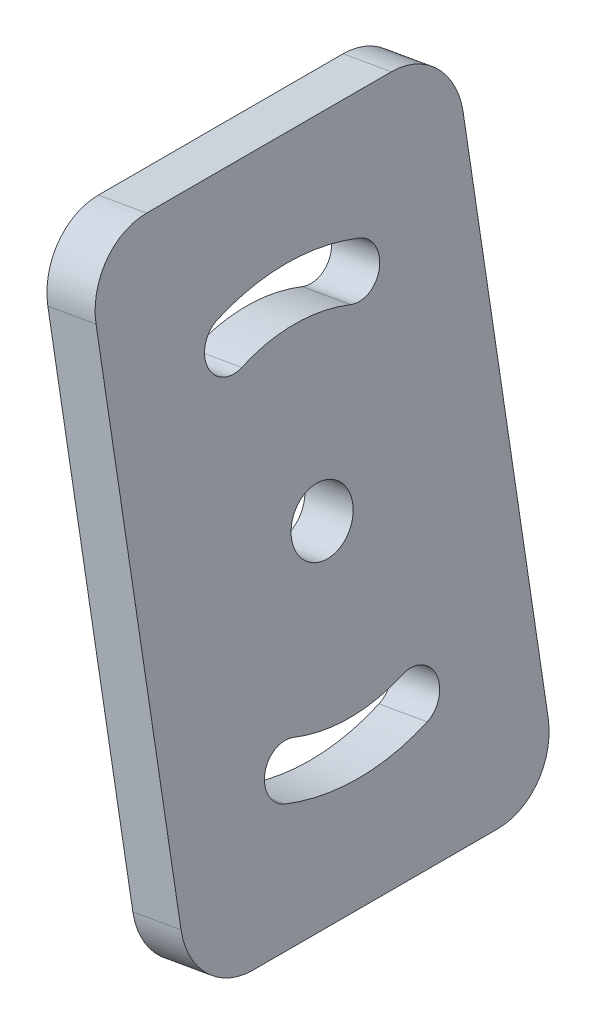
ISO-10303-21;
HEADER;
FILE_DESCRIPTION(('STEP AP214'),'2;1');
FILE_NAME('part.step','',(''),(''),'','','');
FILE_SCHEMA(('AUTOMOTIVE_DESIGN { 1 0 10303 214 1 1 1 1 }'));
ENDSEC;
DATA;
#1=APPLICATION_CONTEXT('core data for automotive mechanical design processes');
#2=APPLICATION_PROTOCOL_DEFINITION('international standard','automotive_design',2000,#1);
#3=PRODUCT_CONTEXT('',#1,'mechanical');
#4=PRODUCT('Part','Part','',(#3));
#5=PRODUCT_RELATED_PRODUCT_CATEGORY('part','',(#4));
#6=PRODUCT_DEFINITION_FORMATION('','',#4);
#7=PRODUCT_DEFINITION_CONTEXT('part definition',#1,'design');
#8=PRODUCT_DEFINITION('design','',#6,#7);
#9=PRODUCT_DEFINITION_SHAPE('','',#8);
#10=(LENGTH_UNIT() NAMED_UNIT(*) SI_UNIT(.MILLI.,.METRE.));
#11=(NAMED_UNIT(*) PLANE_ANGLE_UNIT() SI_UNIT($,.RADIAN.));
#12=(NAMED_UNIT(*) SI_UNIT($,.STERADIAN.) SOLID_ANGLE_UNIT());
#13=UNCERTAINTY_MEASURE_WITH_UNIT(LENGTH_MEASURE(1.E-05),#10,'distance_accuracy_value','');
#14=(GEOMETRIC_REPRESENTATION_CONTEXT(3) GLOBAL_UNCERTAINTY_ASSIGNED_CONTEXT((#13)) GLOBAL_UNIT_ASSIGNED_CONTEXT((#10,
#11,#12)) REPRESENTATION_CONTEXT('',''));
#15=CARTESIAN_POINT('',(0.,0.,0.));
#16=DIRECTION('',(0.,0.,1.));
#17=DIRECTION('',(1.,0.,0.));
#18=AXIS2_PLACEMENT_3D('',#15,#16,#17);
#19=CARTESIAN_POINT('',(344.97515757881,88.1418249425329,580.));
#20=DIRECTION('',(-0.984807753012208,-0.173648177666931,0.));
#21=DIRECTION('',(0.173648177666931,-0.984807753012208,0.));
#22=AXIS2_PLACEMENT_3D('',#19,#20,#21);
#23=CYLINDRICAL_SURFACE('',#22,10.);
#24=CARTESIAN_POINT('',(337.096695554713,86.7526395211975,580.));
#25=DIRECTION('',(0.984807753012208,0.173648177666931,0.));
#26=DIRECTION('',(-0.173648177666931,0.984807753012208,0.));
#27=AXIS2_PLACEMENT_3D('',#24,#25,#26);
#28=CIRCLE('',#27,10.);
#29=CARTESIAN_POINT('',(338.833177331382,76.9045619910754,580.));
#30=VERTEX_POINT('',#29);
#31=CARTESIAN_POINT('',(337.096695554712,86.7526395211975,570.));
#32=VERTEX_POINT('',#31);
#33=EDGE_CURVE('E188',#30,#32,#28,.T.);
#34=ORIENTED_EDGE('',*,*,#33,.T.);
#35=DIRECTION('',(-0.984807753012208,-0.173648177666931,0.));
#36=VECTOR('',#35,1.);
#37=CARTESIAN_POINT('',(344.97515757881,88.141824942533,570.));
#38=LINE('',#37,#36);
#39=CARTESIAN_POINT('',(344.97515757881,88.141824942533,570.));
#40=VERTEX_POINT('',#39);
#41=EDGE_CURVE('E11',#40,#32,#38,.T.);
#42=ORIENTED_EDGE('',*,*,#41,.F.);
#43=CARTESIAN_POINT('',(344.97515757881,88.1418249425329,580.));
#44=DIRECTION('',(0.984807753012208,0.173648177666931,0.));
#45=DIRECTION('',(-0.173648177666931,0.984807753012208,0.));
#46=AXIS2_PLACEMENT_3D('',#43,#44,#45);
#47=CIRCLE('',#46,10.);
#48=CARTESIAN_POINT('',(346.71163935548,78.2937474124108,580.));
#49=VERTEX_POINT('',#48);
#50=EDGE_CURVE('E227',#49,#40,#47,.T.);
#51=ORIENTED_EDGE('',*,*,#50,.F.);
#52=DIRECTION('',(-0.984807753012208,-0.173648177666931,0.));
#53=VECTOR('',#52,1.);
#54=CARTESIAN_POINT('',(346.71163935548,78.2937474124108,580.));
#55=LINE('',#54,#53);
#56=EDGE_CURVE('E245',#49,#30,#55,.T.);
#57=ORIENTED_EDGE('',*,*,#56,.T.);
#58=EDGE_LOOP('',(#34,#42,#51,#57));
#59=FACE_BOUND('',#58,.T.);
#60=ADVANCED_FACE('F39',(#59),#23,.T.);
#61=CARTESIAN_POINT('',(331.083303365456,166.926445183509,570.));
#62=DIRECTION('',(0.,0.,1.));
#63=DIRECTION('',(1.,0.,0.));
#64=AXIS2_PLACEMENT_3D('',#61,#62,#63);
#65=PLANE('',#64);
#66=DIRECTION('',(-0.173648177666931,0.984807753012208,0.));
#67=VECTOR('',#66,1.);
#68=CARTESIAN_POINT('',(323.204841341358,165.537259762174,570.));
#69=LINE('',#68,#67);
#70=CARTESIAN_POINT('',(323.204841341358,165.537259762174,570.));
#71=VERTEX_POINT('',#70);
#72=EDGE_CURVE('E248',#32,#71,#69,.T.);
#73=ORIENTED_EDGE('',*,*,#72,.T.);
#74=DIRECTION('',(-0.984807753012208,-0.173648177666931,0.));
#75=VECTOR('',#74,1.);
#76=CARTESIAN_POINT('',(331.083303365456,166.926445183509,570.));
#77=LINE('',#76,#75);
#78=CARTESIAN_POINT('',(331.083303365456,166.926445183509,570.));
#79=VERTEX_POINT('',#78);
#80=EDGE_CURVE('E46',#79,#71,#77,.T.);
#81=ORIENTED_EDGE('',*,*,#80,.F.);
#82=DIRECTION('',(-0.173648177666931,0.984807753012208,0.));
#83=VECTOR('',#82,1.);
#84=CARTESIAN_POINT('',(331.083303365456,166.926445183509,570.));
#85=LINE('',#84,#83);
#86=EDGE_CURVE('E230',#40,#79,#85,.T.);
#87=ORIENTED_EDGE('',*,*,#86,.F.);
#88=ORIENTED_EDGE('',*,*,#41,.T.);
#89=EDGE_LOOP('',(#73,#81,#87,#88));
#90=FACE_BOUND('',#89,.T.);
#91=ADVANCED_FACE('F304',(#90),#65,.F.);
#92=CARTESIAN_POINT('',(331.083303365456,166.92644518351,580.));
#93=DIRECTION('',(-0.984807753012208,-0.173648177666931,0.));
#94=DIRECTION('',(0.173648177666931,-0.984807753012208,0.));
#95=AXIS2_PLACEMENT_3D('',#92,#93,#94);
#96=CYLINDRICAL_SURFACE('',#95,10.);
#97=CARTESIAN_POINT('',(323.204841341358,165.537259762174,580.));
#98=DIRECTION('',(0.984807753012208,0.173648177666931,0.));
#99=DIRECTION('',(0.173648177666931,-0.984807753012208,0.));
#100=AXIS2_PLACEMENT_3D('',#97,#98,#99);
#101=CIRCLE('',#100,10.);
#102=CARTESIAN_POINT('',(321.468359564689,175.385337292296,580.));
#103=VERTEX_POINT('',#102);
#104=EDGE_CURVE('E250',#71,#103,#101,.T.);
#105=ORIENTED_EDGE('',*,*,#104,.T.);
#106=DIRECTION('',(-0.984807753012208,-0.173648177666931,0.));
#107=VECTOR('',#106,1.);
#108=CARTESIAN_POINT('',(329.346821588786,176.774522713632,580.));
#109=LINE('',#108,#107);
#110=CARTESIAN_POINT('',(329.346821588786,176.774522713632,580.));
#111=VERTEX_POINT('',#110);
#112=EDGE_CURVE('E275',#111,#103,#109,.T.);
#113=ORIENTED_EDGE('',*,*,#112,.F.);
#114=CARTESIAN_POINT('',(331.083303365456,166.92644518351,580.));
#115=DIRECTION('',(0.984807753012208,0.173648177666931,0.));
#116=DIRECTION('',(0.173648177666931,-0.984807753012208,0.));
#117=AXIS2_PLACEMENT_3D('',#114,#115,#116);
#118=CIRCLE('',#117,10.);
#119=EDGE_CURVE('E233',#79,#111,#118,.T.);
#120=ORIENTED_EDGE('',*,*,#119,.F.);
#121=ORIENTED_EDGE('',*,*,#80,.T.);
#122=EDGE_LOOP('',(#105,#113,#120,#121));
#123=FACE_BOUND('',#122,.T.);
#124=ADVANCED_FACE('F282',(#123),#96,.T.);
#125=CARTESIAN_POINT('',(329.346821588786,176.774522713632,620.));
#126=DIRECTION('',(0.173648177666931,-0.984807753012208,0.));
#127=DIRECTION('',(0.984807753012208,0.173648177666931,0.));
#128=AXIS2_PLACEMENT_3D('',#125,#126,#127);
#129=PLANE('',#128);
#130=DIRECTION('',(0.,0.,1.));
#131=VECTOR('',#130,1.);
#132=CARTESIAN_POINT('',(321.468359564689,175.385337292296,620.));
#133=LINE('',#132,#131);
#134=CARTESIAN_POINT('',(321.468359564689,175.385337292296,620.));
#135=VERTEX_POINT('',#134);
#136=EDGE_CURVE('E252',#103,#135,#133,.T.);
#137=ORIENTED_EDGE('',*,*,#136,.T.);
#138=DIRECTION('',(-0.984807753012208,-0.173648177666931,0.));
#139=VECTOR('',#138,1.);
#140=CARTESIAN_POINT('',(329.346821588786,176.774522713632,620.));
#141=LINE('',#140,#139);
#142=CARTESIAN_POINT('',(329.346821588786,176.774522713632,620.));
#143=VERTEX_POINT('',#142);
#144=EDGE_CURVE('E272',#143,#135,#141,.T.);
#145=ORIENTED_EDGE('',*,*,#144,.F.);
#146=DIRECTION('',(0.,0.,1.));
#147=VECTOR('',#146,1.);
#148=CARTESIAN_POINT('',(329.346821588786,176.774522713632,620.));
#149=LINE('',#148,#147);
#150=EDGE_CURVE('E235',#111,#143,#149,.T.);
#151=ORIENTED_EDGE('',*,*,#150,.F.);
#152=ORIENTED_EDGE('',*,*,#112,.T.);
#153=EDGE_LOOP('',(#137,#145,#151,#152));
#154=FACE_BOUND('',#153,.T.);
#155=ADVANCED_FACE('F292',(#154),#129,.F.);
#156=CARTESIAN_POINT('',(331.083303365456,166.92644518351,620.));
#157=DIRECTION('',(-0.984807753012208,-0.173648177666931,0.));
#158=DIRECTION('',(0.173648177666931,-0.984807753012208,0.));
#159=AXIS2_PLACEMENT_3D('',#156,#157,#158);
#160=CYLINDRICAL_SURFACE('',#159,10.);
#161=CARTESIAN_POINT('',(323.204841341358,165.537259762174,620.));
#162=DIRECTION('',(0.984807753012208,0.173648177666931,0.));
#163=DIRECTION('',(-0.173648177666931,0.984807753012208,0.));
#164=AXIS2_PLACEMENT_3D('',#161,#162,#163);
#165=CIRCLE('',#164,10.);
#166=CARTESIAN_POINT('',(323.204841341358,165.537259762174,630.));
#167=VERTEX_POINT('',#166);
#168=EDGE_CURVE('E254',#135,#167,#165,.T.);
#169=ORIENTED_EDGE('',*,*,#168,.T.);
#170=DIRECTION('',(-0.984807753012208,-0.173648177666931,0.));
#171=VECTOR('',#170,1.);
#172=CARTESIAN_POINT('',(331.083303365456,166.926445183509,630.));
#173=LINE('',#172,#171);
#174=CARTESIAN_POINT('',(331.083303365456,166.926445183509,630.));
#175=VERTEX_POINT('',#174);
#176=EDGE_CURVE('E269',#175,#167,#173,.T.);
#177=ORIENTED_EDGE('',*,*,#176,.F.);
#178=CARTESIAN_POINT('',(331.083303365456,166.92644518351,620.));
#179=DIRECTION('',(0.984807753012208,0.173648177666931,0.));
#180=DIRECTION('',(-0.173648177666931,0.984807753012208,0.));
#181=AXIS2_PLACEMENT_3D('',#178,#179,#180);
#182=CIRCLE('',#181,10.);
#183=EDGE_CURVE('E237',#143,#175,#182,.T.);
#184=ORIENTED_EDGE('',*,*,#183,.F.);
#185=ORIENTED_EDGE('',*,*,#144,.T.);
#186=EDGE_LOOP('',(#169,#177,#184,#185));
#187=FACE_BOUND('',#186,.T.);
#188=ADVANCED_FACE('F296',(#187),#160,.T.);
#189=CARTESIAN_POINT('',(331.083303365456,166.926445183509,630.));
#190=DIRECTION('',(0.,0.,-1.));
#191=DIRECTION('',(-1.,0.,0.));
#192=AXIS2_PLACEMENT_3D('',#189,#190,#191);
#193=PLANE('',#192);
#194=DIRECTION('',(0.173648177666931,-0.984807753012208,0.));
#195=VECTOR('',#194,1.);
#196=CARTESIAN_POINT('',(323.204841341358,165.537259762174,630.));
#197=LINE('',#196,#195);
#198=CARTESIAN_POINT('',(337.096695554713,86.7526395211975,630.));
#199=VERTEX_POINT('',#198);
#200=EDGE_CURVE('E256',#167,#199,#197,.T.);
#201=ORIENTED_EDGE('',*,*,#200,.T.);
#202=DIRECTION('',(-0.984807753012208,-0.173648177666931,0.));
#203=VECTOR('',#202,1.);
#204=CARTESIAN_POINT('',(344.97515757881,88.141824942533,630.));
#205=LINE('',#204,#203);
#206=CARTESIAN_POINT('',(344.97515757881,88.141824942533,630.));
#207=VERTEX_POINT('',#206);
#208=EDGE_CURVE('E266',#207,#199,#205,.T.);
#209=ORIENTED_EDGE('',*,*,#208,.F.);
#210=DIRECTION('',(0.173648177666931,-0.984807753012208,0.));
#211=VECTOR('',#210,1.);
#212=CARTESIAN_POINT('',(331.083303365456,166.926445183509,630.));
#213=LINE('',#212,#211);
#214=EDGE_CURVE('E239',#175,#207,#213,.T.);
#215=ORIENTED_EDGE('',*,*,#214,.F.);
#216=ORIENTED_EDGE('',*,*,#176,.T.);
#217=EDGE_LOOP('',(#201,#209,#215,#216));
#218=FACE_BOUND('',#217,.T.);
#219=ADVANCED_FACE('F317',(#218),#193,.F.);
#220=CARTESIAN_POINT('',(344.97515757881,88.1418249425329,620.));
#221=DIRECTION('',(-0.984807753012208,-0.173648177666931,0.));
#222=DIRECTION('',(0.173648177666931,-0.984807753012208,0.));
#223=AXIS2_PLACEMENT_3D('',#220,#221,#222);
#224=CYLINDRICAL_SURFACE('',#223,10.);
#225=CARTESIAN_POINT('',(337.096695554713,86.7526395211975,620.));
#226=DIRECTION('',(0.984807753012208,0.173648177666931,0.));
#227=DIRECTION('',(-0.173648177666931,0.984807753012208,0.));
#228=AXIS2_PLACEMENT_3D('',#225,#226,#227);
#229=CIRCLE('',#228,10.);
#230=CARTESIAN_POINT('',(338.833177331382,76.9045619910754,620.));
#231=VERTEX_POINT('',#230);
#232=EDGE_CURVE('E258',#199,#231,#229,.T.);
#233=ORIENTED_EDGE('',*,*,#232,.T.);
#234=DIRECTION('',(-0.984807753012208,-0.173648177666931,0.));
#235=VECTOR('',#234,1.);
#236=CARTESIAN_POINT('',(346.71163935548,78.2937474124108,620.));
#237=LINE('',#236,#235);
#238=CARTESIAN_POINT('',(346.71163935548,78.2937474124108,620.));
#239=VERTEX_POINT('',#238);
#240=EDGE_CURVE('E263',#239,#231,#237,.T.);
#241=ORIENTED_EDGE('',*,*,#240,.F.);
#242=CARTESIAN_POINT('',(344.97515757881,88.1418249425329,620.));
#243=DIRECTION('',(0.984807753012208,0.173648177666931,0.));
#244=DIRECTION('',(-0.173648177666931,0.984807753012208,0.));
#245=AXIS2_PLACEMENT_3D('',#242,#243,#244);
#246=CIRCLE('',#245,10.);
#247=EDGE_CURVE('E241',#207,#239,#246,.T.);
#248=ORIENTED_EDGE('',*,*,#247,.F.);
#249=ORIENTED_EDGE('',*,*,#208,.T.);
#250=EDGE_LOOP('',(#233,#241,#248,#249));
#251=FACE_BOUND('',#250,.T.);
#252=ADVANCED_FACE('F315',(#251),#224,.T.);
#253=CARTESIAN_POINT('',(346.71163935548,78.2937474124108,620.));
#254=DIRECTION('',(-0.173648177666931,0.984807753012208,0.));
#255=DIRECTION('',(-0.984807753012208,-0.173648177666931,0.));
#256=AXIS2_PLACEMENT_3D('',#253,#254,#255);
#257=PLANE('',#256);
#258=DIRECTION('',(0.,0.,-1.));
#259=VECTOR('',#258,1.);
#260=CARTESIAN_POINT('',(338.833177331382,76.9045619910754,620.));
#261=LINE('',#260,#259);
#262=EDGE_CURVE('E231',#231,#30,#261,.T.);
#263=ORIENTED_EDGE('',*,*,#262,.T.);
#264=ORIENTED_EDGE('',*,*,#56,.F.);
#265=DIRECTION('',(0.,0.,-1.));
#266=VECTOR('',#265,1.);
#267=CARTESIAN_POINT('',(346.71163935548,78.2937474124108,620.));
#268=LINE('',#267,#266);
#269=EDGE_CURVE('E243',#239,#49,#268,.T.);
#270=ORIENTED_EDGE('',*,*,#269,.F.);
#271=ORIENTED_EDGE('',*,*,#240,.T.);
#272=EDGE_LOOP('',(#263,#264,#270,#271));
#273=FACE_BOUND('',#272,.T.);
#274=ADVANCED_FACE('F310',(#273),#257,.F.);
#275=CARTESIAN_POINT('',(344.97515757881,88.1418249425329,580.));
#276=DIRECTION('',(0.984807753012208,0.173648177666931,0.));
#277=DIRECTION('',(-0.173648177666931,0.984807753012208,0.));
#278=AXIS2_PLACEMENT_3D('',#275,#276,#277);
#279=PLANE('',#278);
#280=CARTESIAN_POINT('',(333.133953137137,155.296632414971,589.73939570023));
#281=DIRECTION('',(0.984807753012208,0.173648177666931,0.));
#282=DIRECTION('',(-0.173648177666931,0.984807753012208,0.));
#283=AXIS2_PLACEMENT_3D('',#280,#281,#282);
#284=CIRCLE('',#283,3.99999999999994);
#285=CARTESIAN_POINT('',(333.786656781803,151.594966101378,591.107476273533));
#286=VERTEX_POINT('',#285);
#287=CARTESIAN_POINT('',(332.481249492471,158.998298728564,588.371315126928));
#288=VERTEX_POINT('',#287);
#289=EDGE_CURVE('E53',#286,#288,#284,.T.);
#290=ORIENTED_EDGE('',*,*,#289,.F.);
#291=CARTESIAN_POINT('',(338.029230472133,127.534135063021,600.));
#292=DIRECTION('',(-0.984807753012208,-0.173648177666931,0.));
#293=DIRECTION('',(-0.173648177666931,0.984807753012208,0.));
#294=AXIS2_PLACEMENT_3D('',#291,#292,#293);
#295=CIRCLE('',#294,26.);
#296=CARTESIAN_POINT('',(333.786656781803,151.594966101378,608.892523726468));
#297=VERTEX_POINT('',#296);
#298=EDGE_CURVE('E172',#297,#286,#295,.T.);
#299=ORIENTED_EDGE('',*,*,#298,.F.);
#300=CARTESIAN_POINT('',(333.133953137137,155.296632414971,610.26060429977));
#301=DIRECTION('',(0.984807753012208,0.173648177666931,0.));
#302=DIRECTION('',(-0.173648177666931,0.984807753012208,0.));
#303=AXIS2_PLACEMENT_3D('',#300,#301,#302);
#304=CIRCLE('',#303,3.99999999999994);
#305=CARTESIAN_POINT('',(332.481249492471,158.998298728564,611.628684873073));
#306=VERTEX_POINT('',#305);
#307=EDGE_CURVE('E175',#306,#297,#304,.T.);
#308=ORIENTED_EDGE('',*,*,#307,.F.);
#309=CARTESIAN_POINT('',(338.029230472133,127.534135063021,600.));
#310=DIRECTION('',(0.984807753012208,0.173648177666931,0.));
#311=DIRECTION('',(-0.173648177666931,0.984807753012208,0.));
#312=AXIS2_PLACEMENT_3D('',#309,#310,#311);
#313=CIRCLE('',#312,33.9999999999999);
#314=EDGE_CURVE('E181',#288,#306,#313,.T.);
#315=ORIENTED_EDGE('',*,*,#314,.F.);
#316=EDGE_LOOP('',(#290,#299,#308,#315));
#317=FACE_BOUND('',#316,.T.);
#318=CARTESIAN_POINT('',(338.029230472133,127.534135063021,600.));
#319=DIRECTION('',(0.984807753012208,0.173648177666931,0.));
#320=DIRECTION('',(-0.173648177666931,0.984807753012208,0.));
#321=AXIS2_PLACEMENT_3D('',#318,#319,#320);
#322=CIRCLE('',#321,5.00000000000004);
#323=CARTESIAN_POINT('',(337.160989583799,132.458173828082,600.));
#324=VERTEX_POINT('',#323);
#325=EDGE_CURVE('E182',#324,#324,#322,.T.);
#326=ORIENTED_EDGE('',*,*,#325,.F.);
#327=EDGE_LOOP('',(#326));
#328=FACE_BOUND('',#327,.T.);
#329=CARTESIAN_POINT('',(338.029230472133,127.534135063021,600.));
#330=DIRECTION('',(-0.984807753012208,-0.173648177666931,0.));
#331=DIRECTION('',(0.173648177666931,-0.984807753012208,0.));
#332=AXIS2_PLACEMENT_3D('',#329,#330,#331);
#333=CIRCLE('',#332,26.);
#334=CARTESIAN_POINT('',(342.271804162463,103.473304024665,591.107476273533));
#335=VERTEX_POINT('',#334);
#336=CARTESIAN_POINT('',(342.271804162463,103.473304024665,608.892523726468));
#337=VERTEX_POINT('',#336);
#338=EDGE_CURVE('E61',#335,#337,#333,.T.);
#339=ORIENTED_EDGE('',*,*,#338,.F.);
#340=CARTESIAN_POINT('',(342.924507807129,99.7716377110716,589.73939570023));
#341=DIRECTION('',(0.984807753012208,0.173648177666931,0.));
#342=DIRECTION('',(0.173648177666931,-0.984807753012208,0.));
#343=AXIS2_PLACEMENT_3D('',#340,#341,#342);
#344=CIRCLE('',#343,3.99999999999994);
#345=CARTESIAN_POINT('',(343.577211451795,96.0699713974784,588.371315126927));
#346=VERTEX_POINT('',#345);
#347=EDGE_CURVE('E206',#346,#335,#344,.T.);
#348=ORIENTED_EDGE('',*,*,#347,.F.);
#349=CARTESIAN_POINT('',(338.029230472133,127.534135063021,600.));
#350=DIRECTION('',(0.984807753012208,0.173648177666931,0.));
#351=DIRECTION('',(0.173648177666931,-0.984807753012208,0.));
#352=AXIS2_PLACEMENT_3D('',#349,#350,#351);
#353=CIRCLE('',#352,33.9999999999999);
#354=CARTESIAN_POINT('',(343.577211451795,96.0699713974784,611.628684873073));
#355=VERTEX_POINT('',#354);
#356=EDGE_CURVE('E209',#355,#346,#353,.T.);
#357=ORIENTED_EDGE('',*,*,#356,.F.);
#358=CARTESIAN_POINT('',(342.924507807129,99.7716377110716,610.26060429977));
#359=DIRECTION('',(0.984807753012208,0.173648177666931,0.));
#360=DIRECTION('',(0.173648177666931,-0.984807753012208,0.));
#361=AXIS2_PLACEMENT_3D('',#358,#359,#360);
#362=CIRCLE('',#361,3.99999999999994);
#363=EDGE_CURVE('E213',#337,#355,#362,.T.);
#364=ORIENTED_EDGE('',*,*,#363,.F.);
#365=EDGE_LOOP('',(#339,#348,#357,#364));
#366=FACE_BOUND('',#365,.T.);
#367=ORIENTED_EDGE('',*,*,#50,.T.);
#368=ORIENTED_EDGE('',*,*,#86,.T.);
#369=ORIENTED_EDGE('',*,*,#119,.T.);
#370=ORIENTED_EDGE('',*,*,#150,.T.);
#371=ORIENTED_EDGE('',*,*,#183,.T.);
#372=ORIENTED_EDGE('',*,*,#214,.T.);
#373=ORIENTED_EDGE('',*,*,#247,.T.);
#374=ORIENTED_EDGE('',*,*,#269,.T.);
#375=EDGE_LOOP('',(#367,#368,#369,#370,#371,#372,#373,#374));
#376=FACE_BOUND('',#375,.T.);
#377=ADVANCED_FACE('F300',(#317,#328,#366,#376),#279,.T.);
#378=CARTESIAN_POINT('',(337.096695554713,86.7526395211975,580.));
#379=DIRECTION('',(0.984807753012208,0.173648177666931,0.));
#380=DIRECTION('',(-0.173648177666931,0.984807753012208,0.));
#381=AXIS2_PLACEMENT_3D('',#378,#379,#380);
#382=PLANE('',#381);
#383=CARTESIAN_POINT('',(330.150768448036,126.144949641686,600.));
#384=DIRECTION('',(-0.984807753012208,-0.173648177666931,0.));
#385=DIRECTION('',(-0.173648177666931,0.984807753012208,0.));
#386=AXIS2_PLACEMENT_3D('',#383,#384,#385);
#387=CIRCLE('',#386,26.);
#388=CARTESIAN_POINT('',(325.908194757706,150.205780680042,608.892523726468));
#389=VERTEX_POINT('',#388);
#390=CARTESIAN_POINT('',(325.908194757706,150.205780680042,591.107476273533));
#391=VERTEX_POINT('',#390);
#392=EDGE_CURVE('E159',#389,#391,#387,.T.);
#393=ORIENTED_EDGE('',*,*,#392,.T.);
#394=CARTESIAN_POINT('',(325.255491113039,153.907446993636,589.73939570023));
#395=DIRECTION('',(0.984807753012208,0.173648177666931,0.));
#396=DIRECTION('',(-0.173648177666931,0.984807753012208,0.));
#397=AXIS2_PLACEMENT_3D('',#394,#395,#396);
#398=CIRCLE('',#397,3.99999999999994);
#399=CARTESIAN_POINT('',(324.602787468373,157.609113307229,588.371315126928));
#400=VERTEX_POINT('',#399);
#401=EDGE_CURVE('E153',#391,#400,#398,.T.);
#402=ORIENTED_EDGE('',*,*,#401,.T.);
#403=CARTESIAN_POINT('',(330.150768448036,126.144949641686,600.));
#404=DIRECTION('',(0.984807753012208,0.173648177666931,0.));
#405=DIRECTION('',(-0.173648177666931,0.984807753012208,0.));
#406=AXIS2_PLACEMENT_3D('',#403,#404,#405);
#407=CIRCLE('',#406,33.9999999999999);
#408=CARTESIAN_POINT('',(324.602787468373,157.609113307229,611.628684873073));
#409=VERTEX_POINT('',#408);
#410=EDGE_CURVE('E163',#400,#409,#407,.T.);
#411=ORIENTED_EDGE('',*,*,#410,.T.);
#412=CARTESIAN_POINT('',(325.255491113039,153.907446993636,610.26060429977));
#413=DIRECTION('',(0.984807753012208,0.173648177666931,0.));
#414=DIRECTION('',(-0.173648177666931,0.984807753012208,0.));
#415=AXIS2_PLACEMENT_3D('',#412,#413,#414);
#416=CIRCLE('',#415,3.99999999999994);
#417=EDGE_CURVE('E167',#409,#389,#416,.T.);
#418=ORIENTED_EDGE('',*,*,#417,.T.);
#419=EDGE_LOOP('',(#393,#402,#411,#418));
#420=FACE_BOUND('',#419,.T.);
#421=CARTESIAN_POINT('',(330.150768448036,126.144949641686,600.));
#422=DIRECTION('',(0.984807753012208,0.173648177666931,0.));
#423=DIRECTION('',(-0.173648177666931,0.984807753012208,0.));
#424=AXIS2_PLACEMENT_3D('',#421,#422,#423);
#425=CIRCLE('',#424,5.00000000000004);
#426=CARTESIAN_POINT('',(329.282527559701,131.068988406747,600.));
#427=VERTEX_POINT('',#426);
#428=EDGE_CURVE('E194',#427,#427,#425,.T.);
#429=ORIENTED_EDGE('',*,*,#428,.T.);
#430=EDGE_LOOP('',(#429));
#431=FACE_BOUND('',#430,.T.);
#432=CARTESIAN_POINT('',(335.046045783032,98.3824522897361,589.73939570023));
#433=DIRECTION('',(0.984807753012208,0.173648177666931,0.));
#434=DIRECTION('',(0.173648177666931,-0.984807753012208,0.));
#435=AXIS2_PLACEMENT_3D('',#432,#433,#434);
#436=CIRCLE('',#435,3.99999999999994);
#437=CARTESIAN_POINT('',(335.698749427698,94.6807859761429,588.371315126927));
#438=VERTEX_POINT('',#437);
#439=CARTESIAN_POINT('',(334.393342138365,102.084118603329,591.107476273533));
#440=VERTEX_POINT('',#439);
#441=EDGE_CURVE('E199',#438,#440,#436,.T.);
#442=ORIENTED_EDGE('',*,*,#441,.T.);
#443=CARTESIAN_POINT('',(330.150768448036,126.144949641686,600.));
#444=DIRECTION('',(-0.984807753012208,-0.173648177666931,0.));
#445=DIRECTION('',(0.173648177666931,-0.984807753012208,0.));
#446=AXIS2_PLACEMENT_3D('',#443,#444,#445);
#447=CIRCLE('',#446,26.);
#448=CARTESIAN_POINT('',(334.393342138365,102.084118603329,608.892523726468));
#449=VERTEX_POINT('',#448);
#450=EDGE_CURVE('E210',#440,#449,#447,.T.);
#451=ORIENTED_EDGE('',*,*,#450,.T.);
#452=CARTESIAN_POINT('',(335.046045783032,98.3824522897361,610.26060429977));
#453=DIRECTION('',(0.984807753012208,0.173648177666931,0.));
#454=DIRECTION('',(0.173648177666931,-0.984807753012208,0.));
#455=AXIS2_PLACEMENT_3D('',#452,#453,#454);
#456=CIRCLE('',#455,3.99999999999994);
#457=CARTESIAN_POINT('',(335.698749427698,94.6807859761429,611.628684873073));
#458=VERTEX_POINT('',#457);
#459=EDGE_CURVE('E222',#449,#458,#456,.T.);
#460=ORIENTED_EDGE('',*,*,#459,.T.);
#461=CARTESIAN_POINT('',(330.150768448036,126.144949641686,600.));
#462=DIRECTION('',(0.984807753012208,0.173648177666931,0.));
#463=DIRECTION('',(0.173648177666931,-0.984807753012208,0.));
#464=AXIS2_PLACEMENT_3D('',#461,#462,#463);
#465=CIRCLE('',#464,33.9999999999999);
#466=EDGE_CURVE('E219',#458,#438,#465,.T.);
#467=ORIENTED_EDGE('',*,*,#466,.T.);
#468=EDGE_LOOP('',(#442,#451,#460,#467));
#469=FACE_BOUND('',#468,.T.);
#470=ORIENTED_EDGE('',*,*,#33,.F.);
#471=ORIENTED_EDGE('',*,*,#262,.F.);
#472=ORIENTED_EDGE('',*,*,#232,.F.);
#473=ORIENTED_EDGE('',*,*,#200,.F.);
#474=ORIENTED_EDGE('',*,*,#168,.F.);
#475=ORIENTED_EDGE('',*,*,#136,.F.);
#476=ORIENTED_EDGE('',*,*,#104,.F.);
#477=ORIENTED_EDGE('',*,*,#72,.F.);
#478=EDGE_LOOP('',(#470,#471,#472,#473,#474,#475,#476,#477));
#479=FACE_BOUND('',#478,.T.);
#480=ADVANCED_FACE('F169',(#420,#431,#469,#479),#382,.F.);
#481=CARTESIAN_POINT('',(330.150768448036,126.144949641686,600.));
#482=DIRECTION('',(0.984807753012208,0.173648177666931,0.));
#483=DIRECTION('',(-0.173648177666931,0.984807753012208,0.));
#484=AXIS2_PLACEMENT_3D('',#481,#482,#483);
#485=CYLINDRICAL_SURFACE('',#484,26.);
#486=ORIENTED_EDGE('',*,*,#338,.T.);
#487=DIRECTION('',(0.984807753012208,0.173648177666931,0.));
#488=VECTOR('',#487,1.);
#489=CARTESIAN_POINT('',(334.393342138365,102.084118603329,608.892523726468));
#490=LINE('',#489,#488);
#491=EDGE_CURVE('E197',#449,#337,#490,.T.);
#492=ORIENTED_EDGE('',*,*,#491,.F.);
#493=ORIENTED_EDGE('',*,*,#450,.F.);
#494=DIRECTION('',(0.984807753012208,0.173648177666931,0.));
#495=VECTOR('',#494,1.);
#496=CARTESIAN_POINT('',(334.393342138365,102.084118603329,591.107476273533));
#497=LINE('',#496,#495);
#498=EDGE_CURVE('E204',#440,#335,#497,.T.);
#499=ORIENTED_EDGE('',*,*,#498,.T.);
#500=EDGE_LOOP('',(#486,#492,#493,#499));
#501=FACE_BOUND('',#500,.T.);
#502=ADVANCED_FACE('F384',(#501),#485,.T.);
#503=CARTESIAN_POINT('',(335.046045783032,98.3824522897361,589.73939570023));
#504=DIRECTION('',(0.984807753012208,0.173648177666931,0.));
#505=DIRECTION('',(-0.173648177666931,0.984807753012208,0.));
#506=AXIS2_PLACEMENT_3D('',#503,#504,#505);
#507=CYLINDRICAL_SURFACE('',#506,3.99999999999994);
#508=ORIENTED_EDGE('',*,*,#347,.T.);
#509=ORIENTED_EDGE('',*,*,#498,.F.);
#510=ORIENTED_EDGE('',*,*,#441,.F.);
#511=DIRECTION('',(0.984807753012208,0.173648177666931,0.));
#512=VECTOR('',#511,1.);
#513=CARTESIAN_POINT('',(335.698749427698,94.6807859761429,588.371315126927));
#514=LINE('',#513,#512);
#515=EDGE_CURVE('E202',#438,#346,#514,.T.);
#516=ORIENTED_EDGE('',*,*,#515,.T.);
#517=EDGE_LOOP('',(#508,#509,#510,#516));
#518=FACE_BOUND('',#517,.T.);
#519=ADVANCED_FACE('F391',(#518),#507,.F.);
#520=CARTESIAN_POINT('',(330.150768448036,126.144949641686,600.));
#521=DIRECTION('',(0.984807753012208,0.173648177666931,0.));
#522=DIRECTION('',(-0.173648177666931,0.984807753012208,0.));
#523=AXIS2_PLACEMENT_3D('',#520,#521,#522);
#524=CYLINDRICAL_SURFACE('',#523,33.9999999999999);
#525=ORIENTED_EDGE('',*,*,#356,.T.);
#526=ORIENTED_EDGE('',*,*,#515,.F.);
#527=ORIENTED_EDGE('',*,*,#466,.F.);
#528=DIRECTION('',(0.984807753012208,0.173648177666931,0.));
#529=VECTOR('',#528,1.);
#530=CARTESIAN_POINT('',(335.698749427698,94.6807859761429,611.628684873073));
#531=LINE('',#530,#529);
#532=EDGE_CURVE('E200',#458,#355,#531,.T.);
#533=ORIENTED_EDGE('',*,*,#532,.T.);
#534=EDGE_LOOP('',(#525,#526,#527,#533));
#535=FACE_BOUND('',#534,.T.);
#536=ADVANCED_FACE('F398',(#535),#524,.F.);
#537=CARTESIAN_POINT('',(335.046045783032,98.3824522897361,610.26060429977));
#538=DIRECTION('',(0.984807753012208,0.173648177666931,0.));
#539=DIRECTION('',(-0.173648177666931,0.984807753012208,0.));
#540=AXIS2_PLACEMENT_3D('',#537,#538,#539);
#541=CYLINDRICAL_SURFACE('',#540,3.99999999999994);
#542=ORIENTED_EDGE('',*,*,#363,.T.);
#543=ORIENTED_EDGE('',*,*,#532,.F.);
#544=ORIENTED_EDGE('',*,*,#459,.F.);
#545=ORIENTED_EDGE('',*,*,#491,.T.);
#546=EDGE_LOOP('',(#542,#543,#544,#545));
#547=FACE_BOUND('',#546,.T.);
#548=ADVANCED_FACE('F406',(#547),#541,.F.);
#549=CARTESIAN_POINT('',(330.150768448036,126.144949641686,600.));
#550=DIRECTION('',(0.984807753012208,0.173648177666931,0.));
#551=DIRECTION('',(-0.173648177666931,0.984807753012208,0.));
#552=AXIS2_PLACEMENT_3D('',#549,#550,#551);
#553=CYLINDRICAL_SURFACE('',#552,5.00000000000004);
#554=ORIENTED_EDGE('',*,*,#428,.F.);
#555=EDGE_LOOP('',(#554));
#556=FACE_BOUND('',#555,.T.);
#557=ORIENTED_EDGE('',*,*,#325,.T.);
#558=EDGE_LOOP('',(#557));
#559=FACE_BOUND('',#558,.T.);
#560=ADVANCED_FACE('F414',(#556,#559),#553,.F.);
#561=CARTESIAN_POINT('',(325.255491113039,153.907446993636,589.73939570023));
#562=DIRECTION('',(0.984807753012208,0.173648177666931,0.));
#563=DIRECTION('',(-0.173648177666931,0.984807753012208,0.));
#564=AXIS2_PLACEMENT_3D('',#561,#562,#563);
#565=CYLINDRICAL_SURFACE('',#564,3.99999999999994);
#566=ORIENTED_EDGE('',*,*,#289,.T.);
#567=DIRECTION('',(0.984807753012208,0.173648177666931,0.));
#568=VECTOR('',#567,1.);
#569=CARTESIAN_POINT('',(324.602787468373,157.609113307229,588.371315126928));
#570=LINE('',#569,#568);
#571=EDGE_CURVE('E149',#400,#288,#570,.T.);
#572=ORIENTED_EDGE('',*,*,#571,.F.);
#573=ORIENTED_EDGE('',*,*,#401,.F.);
#574=DIRECTION('',(0.984807753012208,0.173648177666931,0.));
#575=VECTOR('',#574,1.);
#576=CARTESIAN_POINT('',(325.908194757706,150.205780680042,591.107476273533));
#577=LINE('',#576,#575);
#578=EDGE_CURVE('E186',#391,#286,#577,.T.);
#579=ORIENTED_EDGE('',*,*,#578,.T.);
#580=EDGE_LOOP('',(#566,#572,#573,#579));
#581=FACE_BOUND('',#580,.T.);
#582=ADVANCED_FACE('F151',(#581),#565,.F.);
#583=CARTESIAN_POINT('',(330.150768448036,126.144949641686,600.));
#584=DIRECTION('',(0.984807753012208,0.173648177666931,0.));
#585=DIRECTION('',(-0.173648177666931,0.984807753012208,0.));
#586=AXIS2_PLACEMENT_3D('',#583,#584,#585);
#587=CYLINDRICAL_SURFACE('',#586,26.);
#588=ORIENTED_EDGE('',*,*,#298,.T.);
#589=ORIENTED_EDGE('',*,*,#578,.F.);
#590=ORIENTED_EDGE('',*,*,#392,.F.);
#591=DIRECTION('',(0.984807753012208,0.173648177666931,0.));
#592=VECTOR('',#591,1.);
#593=CARTESIAN_POINT('',(325.908194757706,150.205780680042,608.892523726468));
#594=LINE('',#593,#592);
#595=EDGE_CURVE('E189',#389,#297,#594,.T.);
#596=ORIENTED_EDGE('',*,*,#595,.T.);
#597=EDGE_LOOP('',(#588,#589,#590,#596));
#598=FACE_BOUND('',#597,.T.);
#599=ADVANCED_FACE('F429',(#598),#587,.T.);
#600=CARTESIAN_POINT('',(325.255491113039,153.907446993636,610.26060429977));
#601=DIRECTION('',(0.984807753012208,0.173648177666931,0.));
#602=DIRECTION('',(-0.173648177666931,0.984807753012208,0.));
#603=AXIS2_PLACEMENT_3D('',#600,#601,#602);
#604=CYLINDRICAL_SURFACE('',#603,3.99999999999994);
#605=ORIENTED_EDGE('',*,*,#307,.T.);
#606=ORIENTED_EDGE('',*,*,#595,.F.);
#607=ORIENTED_EDGE('',*,*,#417,.F.);
#608=DIRECTION('',(0.984807753012208,0.173648177666931,0.));
#609=VECTOR('',#608,1.);
#610=CARTESIAN_POINT('',(324.602787468373,157.609113307229,611.628684873073));
#611=LINE('',#610,#609);
#612=EDGE_CURVE('E158',#409,#306,#611,.T.);
#613=ORIENTED_EDGE('',*,*,#612,.T.);
#614=EDGE_LOOP('',(#605,#606,#607,#613));
#615=FACE_BOUND('',#614,.T.);
#616=ADVANCED_FACE('F436',(#615),#604,.F.);
#617=CARTESIAN_POINT('',(330.150768448036,126.144949641686,600.));
#618=DIRECTION('',(0.984807753012208,0.173648177666931,0.));
#619=DIRECTION('',(-0.173648177666931,0.984807753012208,0.));
#620=AXIS2_PLACEMENT_3D('',#617,#618,#619);
#621=CYLINDRICAL_SURFACE('',#620,33.9999999999999);
#622=ORIENTED_EDGE('',*,*,#314,.T.);
#623=ORIENTED_EDGE('',*,*,#612,.F.);
#624=ORIENTED_EDGE('',*,*,#410,.F.);
#625=ORIENTED_EDGE('',*,*,#571,.T.);
#626=EDGE_LOOP('',(#622,#623,#624,#625));
#627=FACE_BOUND('',#626,.T.);
#628=ADVANCED_FACE('F164',(#627),#621,.F.);
#629=CLOSED_SHELL('',(#60,#91,#124,#155,#188,#219,#252,#274,#377,#480,#502,#519,#536,#548,#560,
#582,#599,#616,#628));
#630=MANIFOLD_SOLID_BREP('B2',#629);
#631=ADVANCED_BREP_SHAPE_REPRESENTATION('',(#18,#630),#14);
#632=SHAPE_DEFINITION_REPRESENTATION(#9,#631);
ENDSEC;
END-ISO-10303-21;
